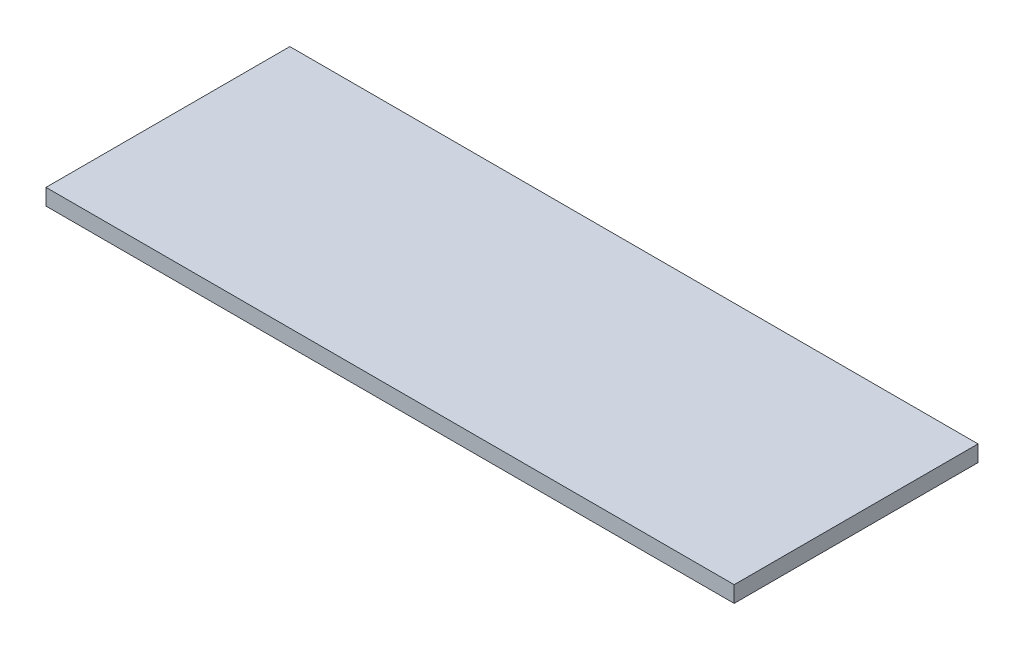
ISO-10303-21;
HEADER;
FILE_DESCRIPTION(('STEP AP214'),'2;1');
FILE_NAME('part.step','',(''),(''),'','','');
FILE_SCHEMA(('AUTOMOTIVE_DESIGN { 1 0 10303 214 1 1 1 1 }'));
ENDSEC;
DATA;
#1=APPLICATION_CONTEXT('core data for automotive mechanical design processes');
#2=APPLICATION_PROTOCOL_DEFINITION('international standard','automotive_design',2000,#1);
#3=PRODUCT_CONTEXT('',#1,'mechanical');
#4=PRODUCT('Part','Part','',(#3));
#5=PRODUCT_RELATED_PRODUCT_CATEGORY('part','',(#4));
#6=PRODUCT_DEFINITION_FORMATION('','',#4);
#7=PRODUCT_DEFINITION_CONTEXT('part definition',#1,'design');
#8=PRODUCT_DEFINITION('design','',#6,#7);
#9=PRODUCT_DEFINITION_SHAPE('','',#8);
#10=(LENGTH_UNIT() NAMED_UNIT(*) SI_UNIT(.MILLI.,.METRE.));
#11=(NAMED_UNIT(*) PLANE_ANGLE_UNIT() SI_UNIT($,.RADIAN.));
#12=(NAMED_UNIT(*) SI_UNIT($,.STERADIAN.) SOLID_ANGLE_UNIT());
#13=UNCERTAINTY_MEASURE_WITH_UNIT(LENGTH_MEASURE(1.E-05),#10,'distance_accuracy_value','');
#14=(GEOMETRIC_REPRESENTATION_CONTEXT(3) GLOBAL_UNCERTAINTY_ASSIGNED_CONTEXT((#13)) GLOBAL_UNIT_ASSIGNED_CONTEXT((#10,
#11,#12)) REPRESENTATION_CONTEXT('',''));
#15=CARTESIAN_POINT('',(0.,0.,0.));
#16=DIRECTION('',(0.,0.,1.));
#17=DIRECTION('',(1.,0.,0.));
#18=AXIS2_PLACEMENT_3D('',#15,#16,#17);
#19=CARTESIAN_POINT('',(0.,30.,0.));
#20=DIRECTION('',(1.,0.,0.));
#21=DIRECTION('',(0.,0.,-1.));
#22=AXIS2_PLACEMENT_3D('',#19,#20,#21);
#23=PLANE('',#22);
#24=DIRECTION('',(0.,0.,1.));
#25=VECTOR('',#24,1.);
#26=CARTESIAN_POINT('',(0.,0.,0.));
#27=LINE('',#26,#25);
#28=CARTESIAN_POINT('',(0.,0.,-450.));
#29=VERTEX_POINT('',#28);
#30=CARTESIAN_POINT('',(0.,0.,0.));
#31=VERTEX_POINT('',#30);
#32=EDGE_CURVE('E97',#29,#31,#27,.T.);
#33=ORIENTED_EDGE('',*,*,#32,.T.);
#34=DIRECTION('',(0.,-1.,0.));
#35=VECTOR('',#34,1.);
#36=CARTESIAN_POINT('',(0.,30.,0.));
#37=LINE('',#36,#35);
#38=CARTESIAN_POINT('',(0.,30.,0.));
#39=VERTEX_POINT('',#38);
#40=EDGE_CURVE('E11',#39,#31,#37,.T.);
#41=ORIENTED_EDGE('',*,*,#40,.F.);
#42=DIRECTION('',(0.,0.,1.));
#43=VECTOR('',#42,1.);
#44=CARTESIAN_POINT('',(0.,30.,0.));
#45=LINE('',#44,#43);
#46=CARTESIAN_POINT('',(0.,30.,-450.));
#47=VERTEX_POINT('',#46);
#48=EDGE_CURVE('E85',#47,#39,#45,.T.);
#49=ORIENTED_EDGE('',*,*,#48,.F.);
#50=DIRECTION('',(0.,-1.,0.));
#51=VECTOR('',#50,1.);
#52=CARTESIAN_POINT('',(0.,30.,-450.));
#53=LINE('',#52,#51);
#54=EDGE_CURVE('E93',#47,#29,#53,.T.);
#55=ORIENTED_EDGE('',*,*,#54,.T.);
#56=EDGE_LOOP('',(#33,#41,#49,#55));
#57=FACE_BOUND('',#56,.T.);
#58=ADVANCED_FACE('F34',(#57),#23,.F.);
#59=CARTESIAN_POINT('',(0.,30.,0.));
#60=DIRECTION('',(0.,0.,-1.));
#61=DIRECTION('',(-1.,0.,0.));
#62=AXIS2_PLACEMENT_3D('',#59,#60,#61);
#63=PLANE('',#62);
#64=DIRECTION('',(1.,0.,0.));
#65=VECTOR('',#64,1.);
#66=CARTESIAN_POINT('',(0.,0.,0.));
#67=LINE('',#66,#65);
#68=CARTESIAN_POINT('',(1270.,0.,0.));
#69=VERTEX_POINT('',#68);
#70=EDGE_CURVE('E89',#31,#69,#67,.T.);
#71=ORIENTED_EDGE('',*,*,#70,.T.);
#72=DIRECTION('',(0.,-1.,0.));
#73=VECTOR('',#72,1.);
#74=CARTESIAN_POINT('',(1270.,30.,0.));
#75=LINE('',#74,#73);
#76=CARTESIAN_POINT('',(1270.,30.,0.));
#77=VERTEX_POINT('',#76);
#78=EDGE_CURVE('E42',#77,#69,#75,.T.);
#79=ORIENTED_EDGE('',*,*,#78,.F.);
#80=DIRECTION('',(1.,0.,0.));
#81=VECTOR('',#80,1.);
#82=CARTESIAN_POINT('',(0.,30.,0.));
#83=LINE('',#82,#81);
#84=EDGE_CURVE('E80',#39,#77,#83,.T.);
#85=ORIENTED_EDGE('',*,*,#84,.F.);
#86=ORIENTED_EDGE('',*,*,#40,.T.);
#87=EDGE_LOOP('',(#71,#79,#85,#86));
#88=FACE_BOUND('',#87,.T.);
#89=ADVANCED_FACE('F88',(#88),#63,.F.);
#90=CARTESIAN_POINT('',(1270.,30.,0.));
#91=DIRECTION('',(-1.,0.,0.));
#92=DIRECTION('',(0.,0.,1.));
#93=AXIS2_PLACEMENT_3D('',#90,#91,#92);
#94=PLANE('',#93);
#95=DIRECTION('',(0.,0.,-1.));
#96=VECTOR('',#95,1.);
#97=CARTESIAN_POINT('',(1270.,0.,0.));
#98=LINE('',#97,#96);
#99=CARTESIAN_POINT('',(1270.,0.,-450.));
#100=VERTEX_POINT('',#99);
#101=EDGE_CURVE('E67',#69,#100,#98,.T.);
#102=ORIENTED_EDGE('',*,*,#101,.T.);
#103=DIRECTION('',(0.,-1.,0.));
#104=VECTOR('',#103,1.);
#105=CARTESIAN_POINT('',(1270.,30.,-450.));
#106=LINE('',#105,#104);
#107=CARTESIAN_POINT('',(1270.,30.,-450.));
#108=VERTEX_POINT('',#107);
#109=EDGE_CURVE('E90',#108,#100,#106,.T.);
#110=ORIENTED_EDGE('',*,*,#109,.F.);
#111=DIRECTION('',(0.,0.,-1.));
#112=VECTOR('',#111,1.);
#113=CARTESIAN_POINT('',(1270.,30.,0.));
#114=LINE('',#113,#112);
#115=EDGE_CURVE('E83',#77,#108,#114,.T.);
#116=ORIENTED_EDGE('',*,*,#115,.F.);
#117=ORIENTED_EDGE('',*,*,#78,.T.);
#118=EDGE_LOOP('',(#102,#110,#116,#117));
#119=FACE_BOUND('',#118,.T.);
#120=ADVANCED_FACE('F91',(#119),#94,.F.);
#121=CARTESIAN_POINT('',(0.,30.,-450.));
#122=DIRECTION('',(0.,0.,1.));
#123=DIRECTION('',(1.,0.,0.));
#124=AXIS2_PLACEMENT_3D('',#121,#122,#123);
#125=PLANE('',#124);
#126=DIRECTION('',(-1.,0.,0.));
#127=VECTOR('',#126,1.);
#128=CARTESIAN_POINT('',(0.,0.,-450.));
#129=LINE('',#128,#127);
#130=EDGE_CURVE('E73',#100,#29,#129,.T.);
#131=ORIENTED_EDGE('',*,*,#130,.T.);
#132=ORIENTED_EDGE('',*,*,#54,.F.);
#133=DIRECTION('',(-1.,0.,0.));
#134=VECTOR('',#133,1.);
#135=CARTESIAN_POINT('',(0.,30.,-450.));
#136=LINE('',#135,#134);
#137=EDGE_CURVE('E50',#108,#47,#136,.T.);
#138=ORIENTED_EDGE('',*,*,#137,.F.);
#139=ORIENTED_EDGE('',*,*,#109,.T.);
#140=EDGE_LOOP('',(#131,#132,#138,#139));
#141=FACE_BOUND('',#140,.T.);
#142=ADVANCED_FACE('F104',(#141),#125,.F.);
#143=CARTESIAN_POINT('',(0.,30.,0.));
#144=DIRECTION('',(0.,-1.,0.));
#145=DIRECTION('',(0.,0.,-1.));
#146=AXIS2_PLACEMENT_3D('',#143,#144,#145);
#147=PLANE('',#146);
#148=ORIENTED_EDGE('',*,*,#48,.T.);
#149=ORIENTED_EDGE('',*,*,#84,.T.);
#150=ORIENTED_EDGE('',*,*,#115,.T.);
#151=ORIENTED_EDGE('',*,*,#137,.T.);
#152=EDGE_LOOP('',(#148,#149,#150,#151));
#153=FACE_BOUND('',#152,.T.);
#154=ADVANCED_FACE('F81',(#153),#147,.F.);
#155=CARTESIAN_POINT('',(0.,0.,0.));
#156=DIRECTION('',(0.,-1.,0.));
#157=DIRECTION('',(0.,0.,-1.));
#158=AXIS2_PLACEMENT_3D('',#155,#156,#157);
#159=PLANE('',#158);
#160=ORIENTED_EDGE('',*,*,#32,.F.);
#161=ORIENTED_EDGE('',*,*,#130,.F.);
#162=ORIENTED_EDGE('',*,*,#101,.F.);
#163=ORIENTED_EDGE('',*,*,#70,.F.);
#164=EDGE_LOOP('',(#160,#161,#162,#163));
#165=FACE_BOUND('',#164,.T.);
#166=ADVANCED_FACE('F107',(#165),#159,.T.);
#167=CLOSED_SHELL('',(#58,#89,#120,#142,#154,#166));
#168=MANIFOLD_SOLID_BREP('B2',#167);
#169=ADVANCED_BREP_SHAPE_REPRESENTATION('',(#18,#168),#14);
#170=SHAPE_DEFINITION_REPRESENTATION(#9,#169);
ENDSEC;
END-ISO-10303-21;
